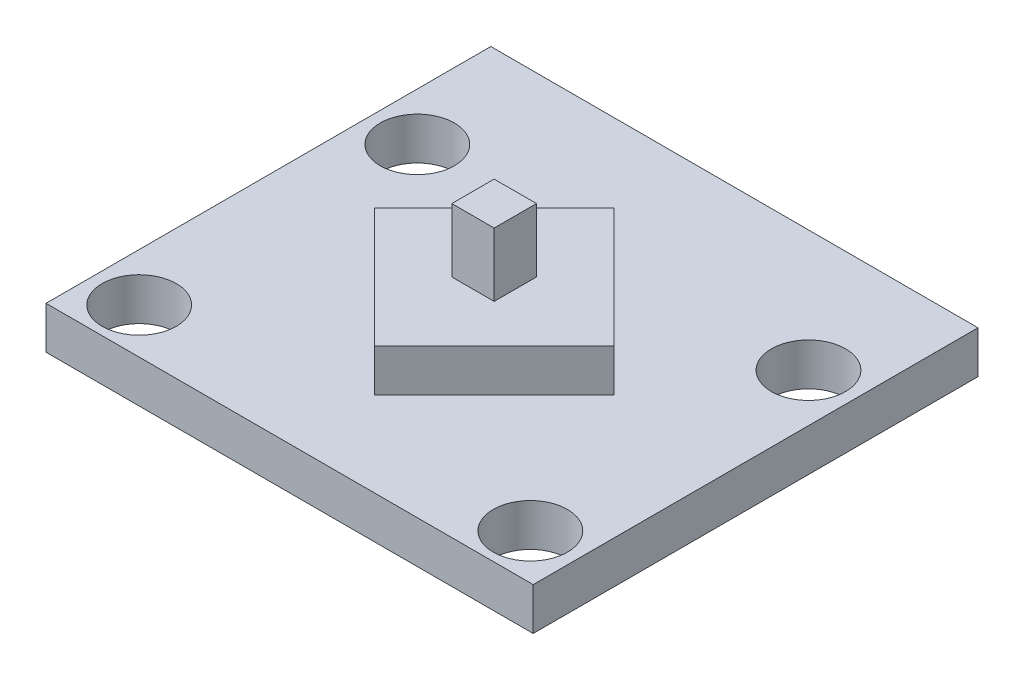
ISO-10303-21;
HEADER;
FILE_DESCRIPTION(('STEP AP214'),'2;1');
FILE_NAME('part.step','',(''),(''),'','','');
FILE_SCHEMA(('AUTOMOTIVE_DESIGN { 1 0 10303 214 1 1 1 1 }'));
ENDSEC;
DATA;
#1=APPLICATION_CONTEXT('core data for automotive mechanical design processes');
#2=APPLICATION_PROTOCOL_DEFINITION('international standard','automotive_design',2000,#1);
#3=PRODUCT_CONTEXT('',#1,'mechanical');
#4=PRODUCT('Part','Part','',(#3));
#5=PRODUCT_RELATED_PRODUCT_CATEGORY('part','',(#4));
#6=PRODUCT_DEFINITION_FORMATION('','',#4);
#7=PRODUCT_DEFINITION_CONTEXT('part definition',#1,'design');
#8=PRODUCT_DEFINITION('design','',#6,#7);
#9=PRODUCT_DEFINITION_SHAPE('','',#8);
#10=(LENGTH_UNIT() NAMED_UNIT(*) SI_UNIT(.MILLI.,.METRE.));
#11=(NAMED_UNIT(*) PLANE_ANGLE_UNIT() SI_UNIT($,.RADIAN.));
#12=(NAMED_UNIT(*) SI_UNIT($,.STERADIAN.) SOLID_ANGLE_UNIT());
#13=UNCERTAINTY_MEASURE_WITH_UNIT(LENGTH_MEASURE(1.E-05),#10,'distance_accuracy_value','');
#14=(GEOMETRIC_REPRESENTATION_CONTEXT(3) GLOBAL_UNCERTAINTY_ASSIGNED_CONTEXT((#13)) GLOBAL_UNIT_ASSIGNED_CONTEXT((#10,
#11,#12)) REPRESENTATION_CONTEXT('',''));
#15=CARTESIAN_POINT('',(0.,0.,0.));
#16=DIRECTION('',(0.,0.,1.));
#17=DIRECTION('',(1.,0.,0.));
#18=AXIS2_PLACEMENT_3D('',#15,#16,#17);
#19=CARTESIAN_POINT('',(0.,4.,0.));
#20=DIRECTION('',(0.,-1.,0.));
#21=DIRECTION('',(0.,0.,-1.));
#22=AXIS2_PLACEMENT_3D('',#19,#20,#21);
#23=PLANE('',#22);
#24=DIRECTION('',(0.707106781186548,0.,-0.707106781186548));
#25=VECTOR('',#24,1.);
#26=CARTESIAN_POINT('',(0.,4.,6.5));
#27=LINE('',#26,#25);
#28=CARTESIAN_POINT('',(0.,4.,6.5));
#29=VERTEX_POINT('',#28);
#30=CARTESIAN_POINT('',(5.65685424949238,4.,0.843145750507621));
#31=VERTEX_POINT('',#30);
#32=EDGE_CURVE('E156',#29,#31,#27,.T.);
#33=ORIENTED_EDGE('',*,*,#32,.T.);
#34=DIRECTION('',(-0.707106781186547,0.,-0.707106781186548));
#35=VECTOR('',#34,1.);
#36=CARTESIAN_POINT('',(0.,4.,-4.81370849898476));
#37=LINE('',#36,#35);
#38=CARTESIAN_POINT('',(0.,4.,-4.81370849898476));
#39=VERTEX_POINT('',#38);
#40=EDGE_CURVE('E159',#31,#39,#37,.T.);
#41=ORIENTED_EDGE('',*,*,#40,.T.);
#42=DIRECTION('',(-0.707106781186548,0.,0.707106781186547));
#43=VECTOR('',#42,1.);
#44=CARTESIAN_POINT('',(-5.65685424949238,4.,0.843145750507619));
#45=LINE('',#44,#43);
#46=CARTESIAN_POINT('',(-5.65685424949238,4.,0.843145750507619));
#47=VERTEX_POINT('',#46);
#48=EDGE_CURVE('E162',#39,#47,#45,.T.);
#49=ORIENTED_EDGE('',*,*,#48,.T.);
#50=DIRECTION('',(0.707106781186547,0.,0.707106781186548));
#51=VECTOR('',#50,1.);
#52=CARTESIAN_POINT('',(-5.65685424949238,4.,0.843145750507619));
#53=LINE('',#52,#51);
#54=EDGE_CURVE('E164',#47,#29,#53,.T.);
#55=ORIENTED_EDGE('',*,*,#54,.T.);
#56=EDGE_LOOP('',(#33,#41,#49,#55));
#57=FACE_BOUND('',#56,.T.);
#58=DIRECTION('',(0.,0.,-1.));
#59=VECTOR('',#58,1.);
#60=CARTESIAN_POINT('',(1.,4.,1.84314575050762));
#61=LINE('',#60,#59);
#62=CARTESIAN_POINT('',(1.,4.,1.84314575050762));
#63=VERTEX_POINT('',#62);
#64=CARTESIAN_POINT('',(1.,4.,-0.15685424949238));
#65=VERTEX_POINT('',#64);
#66=EDGE_CURVE('E53',#63,#65,#61,.T.);
#67=ORIENTED_EDGE('',*,*,#66,.F.);
#68=DIRECTION('',(1.,0.,0.));
#69=VECTOR('',#68,1.);
#70=CARTESIAN_POINT('',(-0.999999999999999,4.,1.84314575050762));
#71=LINE('',#70,#69);
#72=CARTESIAN_POINT('',(-0.999999999999999,4.,1.84314575050762));
#73=VERTEX_POINT('',#72);
#74=EDGE_CURVE('E57',#73,#63,#71,.T.);
#75=ORIENTED_EDGE('',*,*,#74,.F.);
#76=DIRECTION('',(0.,0.,1.));
#77=VECTOR('',#76,1.);
#78=CARTESIAN_POINT('',(-0.999999999999999,4.,1.84314575050762));
#79=LINE('',#78,#77);
#80=CARTESIAN_POINT('',(-0.999999999999999,4.,-0.15685424949238));
#81=VERTEX_POINT('',#80);
#82=EDGE_CURVE('E438',#81,#73,#79,.T.);
#83=ORIENTED_EDGE('',*,*,#82,.F.);
#84=DIRECTION('',(-1.,0.,0.));
#85=VECTOR('',#84,1.);
#86=CARTESIAN_POINT('',(-0.999999999999999,4.,-0.15685424949238));
#87=LINE('',#86,#85);
#88=EDGE_CURVE('E444',#65,#81,#87,.T.);
#89=ORIENTED_EDGE('',*,*,#88,.F.);
#90=EDGE_LOOP('',(#67,#75,#83,#89));
#91=FACE_BOUND('',#90,.T.);
#92=ADVANCED_FACE('F38',(#57,#91),#23,.F.);
#93=CARTESIAN_POINT('',(0.,2.,0.));
#94=DIRECTION('',(0.,-1.,0.));
#95=DIRECTION('',(0.,0.,-1.));
#96=AXIS2_PLACEMENT_3D('',#93,#94,#95);
#97=PLANE('',#96);
#98=DIRECTION('',(0.,0.,-1.));
#99=VECTOR('',#98,1.);
#100=CARTESIAN_POINT('',(11.5,2.,10.5));
#101=LINE('',#100,#99);
#102=CARTESIAN_POINT('',(11.5,2.,10.5));
#103=VERTEX_POINT('',#102);
#104=CARTESIAN_POINT('',(11.5,2.,-10.5));
#105=VERTEX_POINT('',#104);
#106=EDGE_CURVE('E210',#103,#105,#101,.T.);
#107=ORIENTED_EDGE('',*,*,#106,.T.);
#108=DIRECTION('',(-1.,0.,0.));
#109=VECTOR('',#108,1.);
#110=CARTESIAN_POINT('',(-11.5,2.,-10.5));
#111=LINE('',#110,#109);
#112=CARTESIAN_POINT('',(-11.5,2.,-10.5));
#113=VERTEX_POINT('',#112);
#114=EDGE_CURVE('E213',#105,#113,#111,.T.);
#115=ORIENTED_EDGE('',*,*,#114,.T.);
#116=DIRECTION('',(0.,0.,1.));
#117=VECTOR('',#116,1.);
#118=CARTESIAN_POINT('',(-11.5,2.,10.5));
#119=LINE('',#118,#117);
#120=CARTESIAN_POINT('',(-11.5,2.,10.5));
#121=VERTEX_POINT('',#120);
#122=EDGE_CURVE('E216',#113,#121,#119,.T.);
#123=ORIENTED_EDGE('',*,*,#122,.T.);
#124=DIRECTION('',(1.,0.,0.));
#125=VECTOR('',#124,1.);
#126=CARTESIAN_POINT('',(-11.5,2.,10.5));
#127=LINE('',#126,#125);
#128=EDGE_CURVE('E218',#121,#103,#127,.T.);
#129=ORIENTED_EDGE('',*,*,#128,.T.);
#130=EDGE_LOOP('',(#107,#115,#123,#129));
#131=FACE_BOUND('',#130,.T.);
#132=CARTESIAN_POINT('',(9.23330298946546,2.,8.36768083420307));
#133=DIRECTION('',(0.,1.,0.));
#134=DIRECTION('',(0.,0.,1.));
#135=AXIS2_PLACEMENT_3D('',#132,#133,#134);
#136=CIRCLE('',#135,1.75);
#137=CARTESIAN_POINT('',(9.23330298946546,2.,10.1176808342031));
#138=VERTEX_POINT('',#137);
#139=EDGE_CURVE('E195',#138,#138,#136,.T.);
#140=ORIENTED_EDGE('',*,*,#139,.F.);
#141=EDGE_LOOP('',(#140));
#142=FACE_BOUND('',#141,.T.);
#143=CARTESIAN_POINT('',(-9.23330298946546,2.,-4.76412786192559));
#144=DIRECTION('',(0.,1.,0.));
#145=DIRECTION('',(0.,0.,1.));
#146=AXIS2_PLACEMENT_3D('',#143,#144,#145);
#147=CIRCLE('',#146,1.75);
#148=CARTESIAN_POINT('',(-9.23330298946546,2.,-3.01412786192559));
#149=VERTEX_POINT('',#148);
#150=EDGE_CURVE('E185',#149,#149,#147,.T.);
#151=ORIENTED_EDGE('',*,*,#150,.F.);
#152=EDGE_LOOP('',(#151));
#153=FACE_BOUND('',#152,.T.);
#154=CARTESIAN_POINT('',(9.23330298946546,2.,-4.76412786192559));
#155=DIRECTION('',(0.,1.,0.));
#156=DIRECTION('',(0.,0.,1.));
#157=AXIS2_PLACEMENT_3D('',#154,#155,#156);
#158=CIRCLE('',#157,1.75);
#159=CARTESIAN_POINT('',(9.23330298946546,2.,-3.01412786192559));
#160=VERTEX_POINT('',#159);
#161=EDGE_CURVE('E189',#160,#160,#158,.T.);
#162=ORIENTED_EDGE('',*,*,#161,.F.);
#163=EDGE_LOOP('',(#162));
#164=FACE_BOUND('',#163,.T.);
#165=CARTESIAN_POINT('',(-9.23330298946546,2.,8.36768083420307));
#166=DIRECTION('',(0.,1.,0.));
#167=DIRECTION('',(0.,0.,1.));
#168=AXIS2_PLACEMENT_3D('',#165,#166,#167);
#169=CIRCLE('',#168,1.75);
#170=CARTESIAN_POINT('',(-9.23330298946546,2.,10.1176808342031));
#171=VERTEX_POINT('',#170);
#172=EDGE_CURVE('E196',#171,#171,#169,.T.);
#173=ORIENTED_EDGE('',*,*,#172,.F.);
#174=EDGE_LOOP('',(#173));
#175=FACE_BOUND('',#174,.T.);
#176=DIRECTION('',(0.707106781186548,0.,-0.707106781186548));
#177=VECTOR('',#176,1.);
#178=CARTESIAN_POINT('',(0.,2.,6.5));
#179=LINE('',#178,#177);
#180=CARTESIAN_POINT('',(0.,2.,6.5));
#181=VERTEX_POINT('',#180);
#182=CARTESIAN_POINT('',(5.65685424949238,2.,0.84314575050762));
#183=VERTEX_POINT('',#182);
#184=EDGE_CURVE('E147',#181,#183,#179,.T.);
#185=ORIENTED_EDGE('',*,*,#184,.F.);
#186=DIRECTION('',(0.707106781186547,0.,0.707106781186548));
#187=VECTOR('',#186,1.);
#188=CARTESIAN_POINT('',(-5.65685424949238,2.,0.843145750507619));
#189=LINE('',#188,#187);
#190=CARTESIAN_POINT('',(-5.65685424949238,2.,0.84314575050762));
#191=VERTEX_POINT('',#190);
#192=EDGE_CURVE('E160',#191,#181,#189,.T.);
#193=ORIENTED_EDGE('',*,*,#192,.F.);
#194=DIRECTION('',(-0.707106781186548,0.,0.707106781186547));
#195=VECTOR('',#194,1.);
#196=CARTESIAN_POINT('',(-5.65685424949238,2.,0.843145750507619));
#197=LINE('',#196,#195);
#198=CARTESIAN_POINT('',(0.,2.,-4.81370849898476));
#199=VERTEX_POINT('',#198);
#200=EDGE_CURVE('E169',#199,#191,#197,.T.);
#201=ORIENTED_EDGE('',*,*,#200,.F.);
#202=DIRECTION('',(-0.707106781186547,0.,-0.707106781186548));
#203=VECTOR('',#202,1.);
#204=CARTESIAN_POINT('',(0.,2.,-4.81370849898476));
#205=LINE('',#204,#203);
#206=EDGE_CURVE('E150',#183,#199,#205,.T.);
#207=ORIENTED_EDGE('',*,*,#206,.F.);
#208=EDGE_LOOP('',(#185,#193,#201,#207));
#209=FACE_BOUND('',#208,.T.);
#210=ADVANCED_FACE('F252',(#131,#142,#153,#164,#175,#209),#97,.F.);
#211=CARTESIAN_POINT('',(11.5,2.,10.5));
#212=DIRECTION('',(-1.,0.,0.));
#213=DIRECTION('',(0.,0.,1.));
#214=AXIS2_PLACEMENT_3D('',#211,#212,#213);
#215=PLANE('',#214);
#216=DIRECTION('',(0.,0.,-1.));
#217=VECTOR('',#216,1.);
#218=CARTESIAN_POINT('',(11.5,0.,10.5));
#219=LINE('',#218,#217);
#220=CARTESIAN_POINT('',(11.5,0.,10.5));
#221=VERTEX_POINT('',#220);
#222=CARTESIAN_POINT('',(11.5,0.,-10.5));
#223=VERTEX_POINT('',#222);
#224=EDGE_CURVE('E207',#221,#223,#219,.T.);
#225=ORIENTED_EDGE('',*,*,#224,.T.);
#226=DIRECTION('',(0.,-1.,0.));
#227=VECTOR('',#226,1.);
#228=CARTESIAN_POINT('',(11.5,2.,-10.5));
#229=LINE('',#228,#227);
#230=EDGE_CURVE('E11',#105,#223,#229,.T.);
#231=ORIENTED_EDGE('',*,*,#230,.F.);
#232=ORIENTED_EDGE('',*,*,#106,.F.);
#233=DIRECTION('',(0.,-1.,0.));
#234=VECTOR('',#233,1.);
#235=CARTESIAN_POINT('',(11.5,2.,10.5));
#236=LINE('',#235,#234);
#237=EDGE_CURVE('E220',#103,#221,#236,.T.);
#238=ORIENTED_EDGE('',*,*,#237,.T.);
#239=EDGE_LOOP('',(#225,#231,#232,#238));
#240=FACE_BOUND('',#239,.T.);
#241=ADVANCED_FACE('F40',(#240),#215,.F.);
#242=CARTESIAN_POINT('',(-11.5,2.,-10.5));
#243=DIRECTION('',(0.,0.,1.));
#244=DIRECTION('',(1.,0.,0.));
#245=AXIS2_PLACEMENT_3D('',#242,#243,#244);
#246=PLANE('',#245);
#247=DIRECTION('',(-1.,0.,0.));
#248=VECTOR('',#247,1.);
#249=CARTESIAN_POINT('',(-11.5,0.,-10.5));
#250=LINE('',#249,#248);
#251=CARTESIAN_POINT('',(-11.5,0.,-10.5));
#252=VERTEX_POINT('',#251);
#253=EDGE_CURVE('E223',#223,#252,#250,.T.);
#254=ORIENTED_EDGE('',*,*,#253,.T.);
#255=DIRECTION('',(0.,-1.,0.));
#256=VECTOR('',#255,1.);
#257=CARTESIAN_POINT('',(-11.5,2.,-10.5));
#258=LINE('',#257,#256);
#259=EDGE_CURVE('E46',#113,#252,#258,.T.);
#260=ORIENTED_EDGE('',*,*,#259,.F.);
#261=ORIENTED_EDGE('',*,*,#114,.F.);
#262=ORIENTED_EDGE('',*,*,#230,.T.);
#263=EDGE_LOOP('',(#254,#260,#261,#262));
#264=FACE_BOUND('',#263,.T.);
#265=ADVANCED_FACE('F254',(#264),#246,.F.);
#266=CARTESIAN_POINT('',(-11.5,2.,10.5));
#267=DIRECTION('',(1.,0.,0.));
#268=DIRECTION('',(0.,0.,-1.));
#269=AXIS2_PLACEMENT_3D('',#266,#267,#268);
#270=PLANE('',#269);
#271=DIRECTION('',(0.,0.,1.));
#272=VECTOR('',#271,1.);
#273=CARTESIAN_POINT('',(-11.5,0.,10.5));
#274=LINE('',#273,#272);
#275=CARTESIAN_POINT('',(-11.5,0.,10.5));
#276=VERTEX_POINT('',#275);
#277=EDGE_CURVE('E225',#252,#276,#274,.T.);
#278=ORIENTED_EDGE('',*,*,#277,.T.);
#279=DIRECTION('',(0.,-1.,0.));
#280=VECTOR('',#279,1.);
#281=CARTESIAN_POINT('',(-11.5,2.,10.5));
#282=LINE('',#281,#280);
#283=EDGE_CURVE('E230',#121,#276,#282,.T.);
#284=ORIENTED_EDGE('',*,*,#283,.F.);
#285=ORIENTED_EDGE('',*,*,#122,.F.);
#286=ORIENTED_EDGE('',*,*,#259,.T.);
#287=EDGE_LOOP('',(#278,#284,#285,#286));
#288=FACE_BOUND('',#287,.T.);
#289=ADVANCED_FACE('F237',(#288),#270,.F.);
#290=CARTESIAN_POINT('',(-11.5,2.,10.5));
#291=DIRECTION('',(0.,0.,-1.));
#292=DIRECTION('',(-1.,0.,0.));
#293=AXIS2_PLACEMENT_3D('',#290,#291,#292);
#294=PLANE('',#293);
#295=DIRECTION('',(1.,0.,0.));
#296=VECTOR('',#295,1.);
#297=CARTESIAN_POINT('',(-11.5,0.,10.5));
#298=LINE('',#297,#296);
#299=EDGE_CURVE('E214',#276,#221,#298,.T.);
#300=ORIENTED_EDGE('',*,*,#299,.T.);
#301=ORIENTED_EDGE('',*,*,#237,.F.);
#302=ORIENTED_EDGE('',*,*,#128,.F.);
#303=ORIENTED_EDGE('',*,*,#283,.T.);
#304=EDGE_LOOP('',(#300,#301,#302,#303));
#305=FACE_BOUND('',#304,.T.);
#306=ADVANCED_FACE('F246',(#305),#294,.F.);
#307=CARTESIAN_POINT('',(0.,0.,0.));
#308=DIRECTION('',(0.,-1.,0.));
#309=DIRECTION('',(0.,0.,-1.));
#310=AXIS2_PLACEMENT_3D('',#307,#308,#309);
#311=PLANE('',#310);
#312=CARTESIAN_POINT('',(-9.23330298946546,0.,8.36768083420307));
#313=DIRECTION('',(0.,1.,0.));
#314=DIRECTION('',(0.,0.,1.));
#315=AXIS2_PLACEMENT_3D('',#312,#313,#314);
#316=CIRCLE('',#315,1.75);
#317=CARTESIAN_POINT('',(-9.23330298946546,0.,10.1176808342031));
#318=VERTEX_POINT('',#317);
#319=EDGE_CURVE('E192',#318,#318,#316,.T.);
#320=ORIENTED_EDGE('',*,*,#319,.T.);
#321=EDGE_LOOP('',(#320));
#322=FACE_BOUND('',#321,.T.);
#323=CARTESIAN_POINT('',(9.23330298946546,0.,-4.76412786192559));
#324=DIRECTION('',(0.,1.,0.));
#325=DIRECTION('',(0.,0.,1.));
#326=AXIS2_PLACEMENT_3D('',#323,#324,#325);
#327=CIRCLE('',#326,1.75);
#328=CARTESIAN_POINT('',(9.23330298946546,0.,-3.01412786192559));
#329=VERTEX_POINT('',#328);
#330=EDGE_CURVE('E199',#329,#329,#327,.T.);
#331=ORIENTED_EDGE('',*,*,#330,.T.);
#332=EDGE_LOOP('',(#331));
#333=FACE_BOUND('',#332,.T.);
#334=CARTESIAN_POINT('',(-9.23330298946546,0.,-4.76412786192559));
#335=DIRECTION('',(0.,1.,0.));
#336=DIRECTION('',(0.,0.,1.));
#337=AXIS2_PLACEMENT_3D('',#334,#335,#336);
#338=CIRCLE('',#337,1.75);
#339=CARTESIAN_POINT('',(-9.23330298946546,0.,-3.01412786192559));
#340=VERTEX_POINT('',#339);
#341=EDGE_CURVE('E186',#340,#340,#338,.T.);
#342=ORIENTED_EDGE('',*,*,#341,.T.);
#343=EDGE_LOOP('',(#342));
#344=FACE_BOUND('',#343,.T.);
#345=CARTESIAN_POINT('',(9.23330298946546,0.,8.36768083420307));
#346=DIRECTION('',(0.,1.,0.));
#347=DIRECTION('',(0.,0.,1.));
#348=AXIS2_PLACEMENT_3D('',#345,#346,#347);
#349=CIRCLE('',#348,1.75);
#350=CARTESIAN_POINT('',(9.23330298946546,0.,10.1176808342031));
#351=VERTEX_POINT('',#350);
#352=EDGE_CURVE('E204',#351,#351,#349,.T.);
#353=ORIENTED_EDGE('',*,*,#352,.T.);
#354=EDGE_LOOP('',(#353));
#355=FACE_BOUND('',#354,.T.);
#356=ORIENTED_EDGE('',*,*,#224,.F.);
#357=ORIENTED_EDGE('',*,*,#299,.F.);
#358=ORIENTED_EDGE('',*,*,#277,.F.);
#359=ORIENTED_EDGE('',*,*,#253,.F.);
#360=EDGE_LOOP('',(#356,#357,#358,#359));
#361=FACE_BOUND('',#360,.T.);
#362=ADVANCED_FACE('F243',(#322,#333,#344,#355,#361),#311,.T.);
#363=CARTESIAN_POINT('',(9.23330298946546,0.,8.36768083420307));
#364=DIRECTION('',(0.,1.,0.));
#365=DIRECTION('',(0.,0.,1.));
#366=AXIS2_PLACEMENT_3D('',#363,#364,#365);
#367=CYLINDRICAL_SURFACE('',#366,1.75);
#368=ORIENTED_EDGE('',*,*,#352,.F.);
#369=EDGE_LOOP('',(#368));
#370=FACE_BOUND('',#369,.T.);
#371=ORIENTED_EDGE('',*,*,#139,.T.);
#372=EDGE_LOOP('',(#371));
#373=FACE_BOUND('',#372,.T.);
#374=ADVANCED_FACE('F292',(#370,#373),#367,.F.);
#375=CARTESIAN_POINT('',(-9.23330298946546,0.,-4.76412786192559));
#376=DIRECTION('',(0.,1.,0.));
#377=DIRECTION('',(0.,0.,1.));
#378=AXIS2_PLACEMENT_3D('',#375,#376,#377);
#379=CYLINDRICAL_SURFACE('',#378,1.75);
#380=ORIENTED_EDGE('',*,*,#341,.F.);
#381=EDGE_LOOP('',(#380));
#382=FACE_BOUND('',#381,.T.);
#383=ORIENTED_EDGE('',*,*,#150,.T.);
#384=EDGE_LOOP('',(#383));
#385=FACE_BOUND('',#384,.T.);
#386=ADVANCED_FACE('F288',(#382,#385),#379,.F.);
#387=CARTESIAN_POINT('',(9.23330298946546,0.,-4.76412786192559));
#388=DIRECTION('',(0.,1.,0.));
#389=DIRECTION('',(0.,0.,1.));
#390=AXIS2_PLACEMENT_3D('',#387,#388,#389);
#391=CYLINDRICAL_SURFACE('',#390,1.75);
#392=ORIENTED_EDGE('',*,*,#330,.F.);
#393=EDGE_LOOP('',(#392));
#394=FACE_BOUND('',#393,.T.);
#395=ORIENTED_EDGE('',*,*,#161,.T.);
#396=EDGE_LOOP('',(#395));
#397=FACE_BOUND('',#396,.T.);
#398=ADVANCED_FACE('F291',(#394,#397),#391,.F.);
#399=CARTESIAN_POINT('',(-9.23330298946546,0.,8.36768083420307));
#400=DIRECTION('',(0.,1.,0.));
#401=DIRECTION('',(0.,0.,1.));
#402=AXIS2_PLACEMENT_3D('',#399,#400,#401);
#403=CYLINDRICAL_SURFACE('',#402,1.75);
#404=ORIENTED_EDGE('',*,*,#319,.F.);
#405=EDGE_LOOP('',(#404));
#406=FACE_BOUND('',#405,.T.);
#407=ORIENTED_EDGE('',*,*,#172,.T.);
#408=EDGE_LOOP('',(#407));
#409=FACE_BOUND('',#408,.T.);
#410=ADVANCED_FACE('F286',(#406,#409),#403,.F.);
#411=CARTESIAN_POINT('',(0.,4.,6.5));
#412=DIRECTION('',(-0.707106781186547,0.,-0.707106781186548));
#413=DIRECTION('',(-0.707106781186548,0.,0.707106781186547));
#414=AXIS2_PLACEMENT_3D('',#411,#412,#413);
#415=PLANE('',#414);
#416=ORIENTED_EDGE('',*,*,#184,.T.);
#417=DIRECTION('',(0.,-1.,0.));
#418=VECTOR('',#417,1.);
#419=CARTESIAN_POINT('',(5.65685424949238,4.,0.843145750507621));
#420=LINE('',#419,#418);
#421=EDGE_CURVE('E182',#31,#183,#420,.T.);
#422=ORIENTED_EDGE('',*,*,#421,.F.);
#423=ORIENTED_EDGE('',*,*,#32,.F.);
#424=DIRECTION('',(0.,-1.,0.));
#425=VECTOR('',#424,1.);
#426=CARTESIAN_POINT('',(0.,4.,6.5));
#427=LINE('',#426,#425);
#428=EDGE_CURVE('E165',#29,#181,#427,.T.);
#429=ORIENTED_EDGE('',*,*,#428,.T.);
#430=EDGE_LOOP('',(#416,#422,#423,#429));
#431=FACE_BOUND('',#430,.T.);
#432=ADVANCED_FACE('F282',(#431),#415,.F.);
#433=CARTESIAN_POINT('',(0.,4.,-4.81370849898476));
#434=DIRECTION('',(-0.707106781186548,0.,0.707106781186547));
#435=DIRECTION('',(0.707106781186547,0.,0.707106781186548));
#436=AXIS2_PLACEMENT_3D('',#433,#434,#435);
#437=PLANE('',#436);
#438=ORIENTED_EDGE('',*,*,#206,.T.);
#439=DIRECTION('',(0.,-1.,0.));
#440=VECTOR('',#439,1.);
#441=CARTESIAN_POINT('',(0.,4.,-4.81370849898476));
#442=LINE('',#441,#440);
#443=EDGE_CURVE('E179',#39,#199,#442,.T.);
#444=ORIENTED_EDGE('',*,*,#443,.F.);
#445=ORIENTED_EDGE('',*,*,#40,.F.);
#446=ORIENTED_EDGE('',*,*,#421,.T.);
#447=EDGE_LOOP('',(#438,#444,#445,#446));
#448=FACE_BOUND('',#447,.T.);
#449=ADVANCED_FACE('F278',(#448),#437,.F.);
#450=CARTESIAN_POINT('',(-5.65685424949238,4.,0.843145750507619));
#451=DIRECTION('',(0.707106781186547,0.,0.707106781186548));
#452=DIRECTION('',(0.707106781186548,0.,-0.707106781186547));
#453=AXIS2_PLACEMENT_3D('',#450,#451,#452);
#454=PLANE('',#453);
#455=ORIENTED_EDGE('',*,*,#200,.T.);
#456=DIRECTION('',(0.,-1.,0.));
#457=VECTOR('',#456,1.);
#458=CARTESIAN_POINT('',(-5.65685424949238,4.,0.843145750507619));
#459=LINE('',#458,#457);
#460=EDGE_CURVE('E176',#47,#191,#459,.T.);
#461=ORIENTED_EDGE('',*,*,#460,.F.);
#462=ORIENTED_EDGE('',*,*,#48,.F.);
#463=ORIENTED_EDGE('',*,*,#443,.T.);
#464=EDGE_LOOP('',(#455,#461,#462,#463));
#465=FACE_BOUND('',#464,.T.);
#466=ADVANCED_FACE('F274',(#465),#454,.F.);
#467=CARTESIAN_POINT('',(-5.65685424949238,4.,0.843145750507619));
#468=DIRECTION('',(0.707106781186548,0.,-0.707106781186547));
#469=DIRECTION('',(-0.707106781186547,0.,-0.707106781186548));
#470=AXIS2_PLACEMENT_3D('',#467,#468,#469);
#471=PLANE('',#470);
#472=ORIENTED_EDGE('',*,*,#192,.T.);
#473=ORIENTED_EDGE('',*,*,#428,.F.);
#474=ORIENTED_EDGE('',*,*,#54,.F.);
#475=ORIENTED_EDGE('',*,*,#460,.T.);
#476=EDGE_LOOP('',(#472,#473,#474,#475));
#477=FACE_BOUND('',#476,.T.);
#478=ADVANCED_FACE('F271',(#477),#471,.F.);
#479=CARTESIAN_POINT('',(1.,7.,1.84314575050762));
#480=DIRECTION('',(-1.,0.,0.));
#481=DIRECTION('',(0.,0.,1.));
#482=AXIS2_PLACEMENT_3D('',#479,#480,#481);
#483=PLANE('',#482);
#484=ORIENTED_EDGE('',*,*,#66,.T.);
#485=DIRECTION('',(0.,-1.,0.));
#486=VECTOR('',#485,1.);
#487=CARTESIAN_POINT('',(1.,7.,-0.15685424949238));
#488=LINE('',#487,#486);
#489=CARTESIAN_POINT('',(1.,7.,-0.15685424949238));
#490=VERTEX_POINT('',#489);
#491=EDGE_CURVE('E130',#490,#65,#488,.T.);
#492=ORIENTED_EDGE('',*,*,#491,.F.);
#493=DIRECTION('',(0.,0.,-1.));
#494=VECTOR('',#493,1.);
#495=CARTESIAN_POINT('',(1.,7.,1.84314575050762));
#496=LINE('',#495,#494);
#497=CARTESIAN_POINT('',(1.,7.,1.84314575050762));
#498=VERTEX_POINT('',#497);
#499=EDGE_CURVE('E136',#498,#490,#496,.T.);
#500=ORIENTED_EDGE('',*,*,#499,.F.);
#501=DIRECTION('',(0.,-1.,0.));
#502=VECTOR('',#501,1.);
#503=CARTESIAN_POINT('',(1.,7.,1.84314575050762));
#504=LINE('',#503,#502);
#505=EDGE_CURVE('E436',#498,#63,#504,.T.);
#506=ORIENTED_EDGE('',*,*,#505,.T.);
#507=EDGE_LOOP('',(#484,#492,#500,#506));
#508=FACE_BOUND('',#507,.T.);
#509=ADVANCED_FACE('F146',(#508),#483,.F.);
#510=CARTESIAN_POINT('',(-0.999999999999999,7.,-0.15685424949238));
#511=DIRECTION('',(0.,0.,1.));
#512=DIRECTION('',(1.,0.,0.));
#513=AXIS2_PLACEMENT_3D('',#510,#511,#512);
#514=PLANE('',#513);
#515=ORIENTED_EDGE('',*,*,#88,.T.);
#516=DIRECTION('',(0.,-1.,0.));
#517=VECTOR('',#516,1.);
#518=CARTESIAN_POINT('',(-0.999999999999999,7.,-0.15685424949238));
#519=LINE('',#518,#517);
#520=CARTESIAN_POINT('',(-0.999999999999999,7.,-0.15685424949238));
#521=VERTEX_POINT('',#520);
#522=EDGE_CURVE('E132',#521,#81,#519,.T.);
#523=ORIENTED_EDGE('',*,*,#522,.F.);
#524=DIRECTION('',(-1.,0.,0.));
#525=VECTOR('',#524,1.);
#526=CARTESIAN_POINT('',(-0.999999999999999,7.,-0.15685424949238));
#527=LINE('',#526,#525);
#528=EDGE_CURVE('E125',#490,#521,#527,.T.);
#529=ORIENTED_EDGE('',*,*,#528,.F.);
#530=ORIENTED_EDGE('',*,*,#491,.T.);
#531=EDGE_LOOP('',(#515,#523,#529,#530));
#532=FACE_BOUND('',#531,.T.);
#533=ADVANCED_FACE('F128',(#532),#514,.F.);
#534=CARTESIAN_POINT('',(-0.999999999999999,7.,1.84314575050762));
#535=DIRECTION('',(1.,0.,0.));
#536=DIRECTION('',(0.,0.,-1.));
#537=AXIS2_PLACEMENT_3D('',#534,#535,#536);
#538=PLANE('',#537);
#539=ORIENTED_EDGE('',*,*,#82,.T.);
#540=DIRECTION('',(0.,-1.,0.));
#541=VECTOR('',#540,1.);
#542=CARTESIAN_POINT('',(-0.999999999999999,7.,1.84314575050762));
#543=LINE('',#542,#541);
#544=CARTESIAN_POINT('',(-0.999999999999999,7.,1.84314575050762));
#545=VERTEX_POINT('',#544);
#546=EDGE_CURVE('E152',#545,#73,#543,.T.);
#547=ORIENTED_EDGE('',*,*,#546,.F.);
#548=DIRECTION('',(0.,0.,1.));
#549=VECTOR('',#548,1.);
#550=CARTESIAN_POINT('',(-0.999999999999999,7.,1.84314575050762));
#551=LINE('',#550,#549);
#552=EDGE_CURVE('E135',#521,#545,#551,.T.);
#553=ORIENTED_EDGE('',*,*,#552,.F.);
#554=ORIENTED_EDGE('',*,*,#522,.T.);
#555=EDGE_LOOP('',(#539,#547,#553,#554));
#556=FACE_BOUND('',#555,.T.);
#557=ADVANCED_FACE('F359',(#556),#538,.F.);
#558=CARTESIAN_POINT('',(-0.999999999999999,7.,1.84314575050762));
#559=DIRECTION('',(0.,0.,-1.));
#560=DIRECTION('',(-1.,0.,0.));
#561=AXIS2_PLACEMENT_3D('',#558,#559,#560);
#562=PLANE('',#561);
#563=ORIENTED_EDGE('',*,*,#74,.T.);
#564=ORIENTED_EDGE('',*,*,#505,.F.);
#565=DIRECTION('',(1.,0.,0.));
#566=VECTOR('',#565,1.);
#567=CARTESIAN_POINT('',(-0.999999999999999,7.,1.84314575050762));
#568=LINE('',#567,#566);
#569=EDGE_CURVE('E141',#545,#498,#568,.T.);
#570=ORIENTED_EDGE('',*,*,#569,.F.);
#571=ORIENTED_EDGE('',*,*,#546,.T.);
#572=EDGE_LOOP('',(#563,#564,#570,#571));
#573=FACE_BOUND('',#572,.T.);
#574=ADVANCED_FACE('F365',(#573),#562,.F.);
#575=CARTESIAN_POINT('',(0.,7.,0.));
#576=DIRECTION('',(0.,-1.,0.));
#577=DIRECTION('',(0.,0.,-1.));
#578=AXIS2_PLACEMENT_3D('',#575,#576,#577);
#579=PLANE('',#578);
#580=ORIENTED_EDGE('',*,*,#499,.T.);
#581=ORIENTED_EDGE('',*,*,#528,.T.);
#582=ORIENTED_EDGE('',*,*,#552,.T.);
#583=ORIENTED_EDGE('',*,*,#569,.T.);
#584=EDGE_LOOP('',(#580,#581,#582,#583));
#585=FACE_BOUND('',#584,.T.);
#586=ADVANCED_FACE('F139',(#585),#579,.F.);
#587=CLOSED_SHELL('',(#92,#210,#241,#265,#289,#306,#362,#374,#386,#398,#410,#432,#449,#466,#478,
#509,#533,#557,#574,#586));
#588=MANIFOLD_SOLID_BREP('B2',#587);
#589=ADVANCED_BREP_SHAPE_REPRESENTATION('',(#18,#588),#14);
#590=SHAPE_DEFINITION_REPRESENTATION(#9,#589);
ENDSEC;
END-ISO-10303-21;
